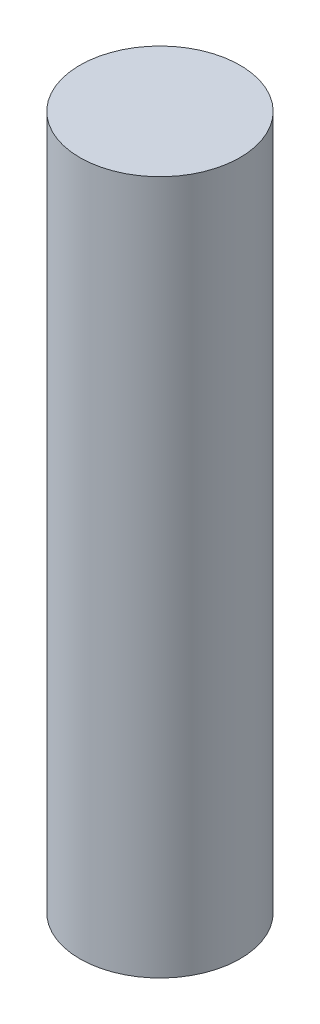
ISO-10303-21;
HEADER;
FILE_DESCRIPTION(('STEP AP214'),'2;1');
FILE_NAME('part.step','',(''),(''),'','','');
FILE_SCHEMA(('AUTOMOTIVE_DESIGN { 1 0 10303 214 1 1 1 1 }'));
ENDSEC;
DATA;
#1=APPLICATION_CONTEXT('core data for automotive mechanical design processes');
#2=APPLICATION_PROTOCOL_DEFINITION('international standard','automotive_design',2000,#1);
#3=PRODUCT_CONTEXT('',#1,'mechanical');
#4=PRODUCT('Part','Part','',(#3));
#5=PRODUCT_RELATED_PRODUCT_CATEGORY('part','',(#4));
#6=PRODUCT_DEFINITION_FORMATION('','',#4);
#7=PRODUCT_DEFINITION_CONTEXT('part definition',#1,'design');
#8=PRODUCT_DEFINITION('design','',#6,#7);
#9=PRODUCT_DEFINITION_SHAPE('','',#8);
#10=(LENGTH_UNIT() NAMED_UNIT(*) SI_UNIT(.MILLI.,.METRE.));
#11=(NAMED_UNIT(*) PLANE_ANGLE_UNIT() SI_UNIT($,.RADIAN.));
#12=(NAMED_UNIT(*) SI_UNIT($,.STERADIAN.) SOLID_ANGLE_UNIT());
#13=UNCERTAINTY_MEASURE_WITH_UNIT(LENGTH_MEASURE(1.E-05),#10,'distance_accuracy_value','');
#14=(GEOMETRIC_REPRESENTATION_CONTEXT(3) GLOBAL_UNCERTAINTY_ASSIGNED_CONTEXT((#13)) GLOBAL_UNIT_ASSIGNED_CONTEXT((#10,
#11,#12)) REPRESENTATION_CONTEXT('',''));
#15=CARTESIAN_POINT('',(0.,0.,0.));
#16=DIRECTION('',(0.,0.,1.));
#17=DIRECTION('',(1.,0.,0.));
#18=AXIS2_PLACEMENT_3D('',#15,#16,#17);
#19=CARTESIAN_POINT('',(0.,13.,0.));
#20=DIRECTION('',(0.,-1.,0.));
#21=DIRECTION('',(0.,0.,-1.));
#22=AXIS2_PLACEMENT_3D('',#19,#20,#21);
#23=CYLINDRICAL_SURFACE('',#22,1.5);
#24=CARTESIAN_POINT('',(0.,13.,0.));
#25=DIRECTION('',(0.,1.,0.));
#26=DIRECTION('',(0.,0.,1.));
#27=AXIS2_PLACEMENT_3D('',#24,#25,#26);
#28=CIRCLE('',#27,1.5);
#29=CARTESIAN_POINT('',(0.,13.,1.5));
#30=VERTEX_POINT('',#29);
#31=EDGE_CURVE('E10',#30,#30,#28,.T.);
#32=ORIENTED_EDGE('',*,*,#31,.F.);
#33=EDGE_LOOP('',(#32));
#34=FACE_BOUND('',#33,.T.);
#35=CARTESIAN_POINT('',(0.,0.,0.));
#36=DIRECTION('',(0.,1.,0.));
#37=DIRECTION('',(0.,0.,1.));
#38=AXIS2_PLACEMENT_3D('',#35,#36,#37);
#39=CIRCLE('',#38,1.5);
#40=CARTESIAN_POINT('',(0.,0.,1.5));
#41=VERTEX_POINT('',#40);
#42=EDGE_CURVE('E34',#41,#41,#39,.T.);
#43=ORIENTED_EDGE('',*,*,#42,.T.);
#44=EDGE_LOOP('',(#43));
#45=FACE_BOUND('',#44,.T.);
#46=ADVANCED_FACE('F31',(#34,#45),#23,.T.);
#47=CARTESIAN_POINT('',(0.,13.,0.));
#48=DIRECTION('',(0.,1.,0.));
#49=DIRECTION('',(0.,0.,1.));
#50=AXIS2_PLACEMENT_3D('',#47,#48,#49);
#51=PLANE('',#50);
#52=ORIENTED_EDGE('',*,*,#31,.T.);
#53=EDGE_LOOP('',(#52));
#54=FACE_BOUND('',#53,.T.);
#55=ADVANCED_FACE('F46',(#54),#51,.T.);
#56=CARTESIAN_POINT('',(0.,0.,0.));
#57=DIRECTION('',(0.,1.,0.));
#58=DIRECTION('',(0.,0.,1.));
#59=AXIS2_PLACEMENT_3D('',#56,#57,#58);
#60=PLANE('',#59);
#61=ORIENTED_EDGE('',*,*,#42,.F.);
#62=EDGE_LOOP('',(#61));
#63=FACE_BOUND('',#62,.T.);
#64=ADVANCED_FACE('F44',(#63),#60,.F.);
#65=CLOSED_SHELL('',(#46,#55,#64));
#66=MANIFOLD_SOLID_BREP('B2',#65);
#67=ADVANCED_BREP_SHAPE_REPRESENTATION('',(#18,#66),#14);
#68=SHAPE_DEFINITION_REPRESENTATION(#9,#67);
ENDSEC;
END-ISO-10303-21;
